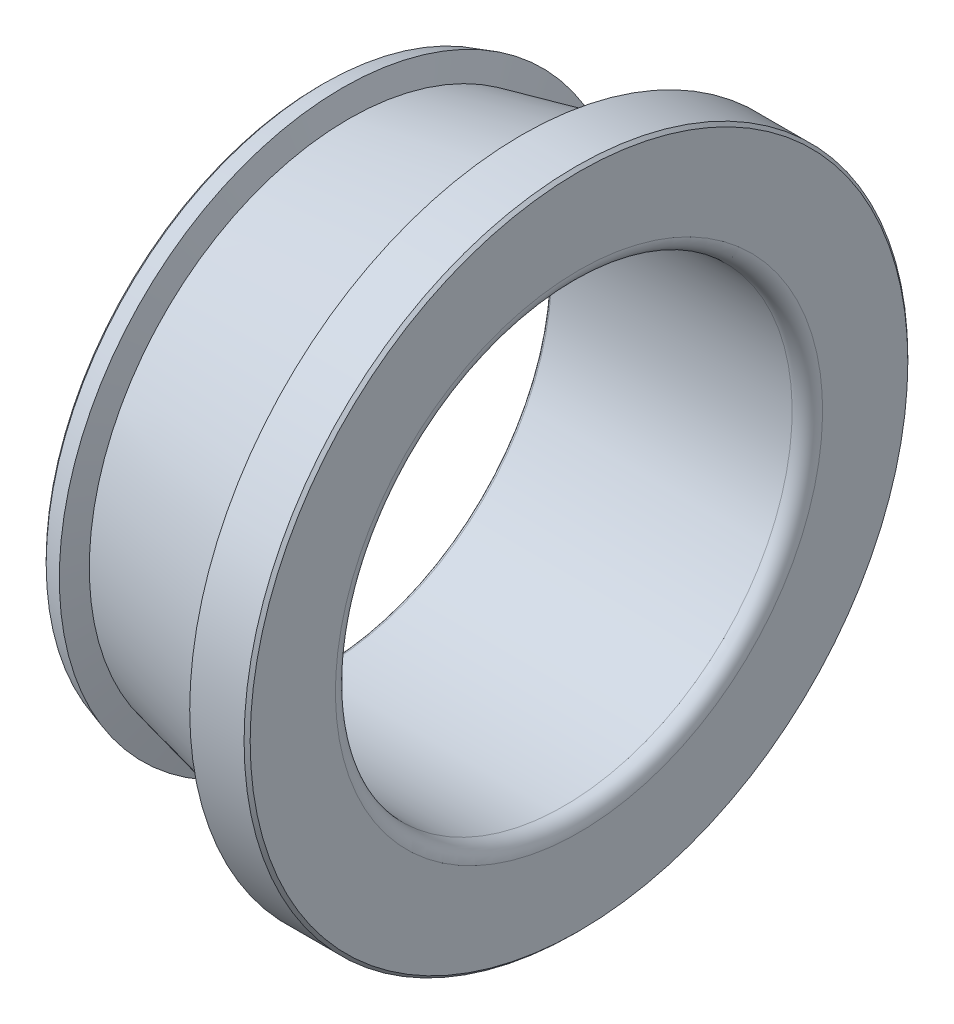
ISO-10303-21;
HEADER;
FILE_DESCRIPTION(('STEP AP214'),'2;1');
FILE_NAME('part.step','',(''),(''),'','','');
FILE_SCHEMA(('AUTOMOTIVE_DESIGN { 1 0 10303 214 1 1 1 1 }'));
ENDSEC;
DATA;
#1=APPLICATION_CONTEXT('core data for automotive mechanical design processes');
#2=APPLICATION_PROTOCOL_DEFINITION('international standard','automotive_design',2000,#1);
#3=PRODUCT_CONTEXT('',#1,'mechanical');
#4=PRODUCT('Part','Part','',(#3));
#5=PRODUCT_RELATED_PRODUCT_CATEGORY('part','',(#4));
#6=PRODUCT_DEFINITION_FORMATION('','',#4);
#7=PRODUCT_DEFINITION_CONTEXT('part definition',#1,'design');
#8=PRODUCT_DEFINITION('design','',#6,#7);
#9=PRODUCT_DEFINITION_SHAPE('','',#8);
#10=(LENGTH_UNIT() NAMED_UNIT(*) SI_UNIT(.MILLI.,.METRE.));
#11=(NAMED_UNIT(*) PLANE_ANGLE_UNIT() SI_UNIT($,.RADIAN.));
#12=(NAMED_UNIT(*) SI_UNIT($,.STERADIAN.) SOLID_ANGLE_UNIT());
#13=UNCERTAINTY_MEASURE_WITH_UNIT(LENGTH_MEASURE(1.E-05),#10,'distance_accuracy_value','');
#14=(GEOMETRIC_REPRESENTATION_CONTEXT(3) GLOBAL_UNCERTAINTY_ASSIGNED_CONTEXT((#13)) GLOBAL_UNIT_ASSIGNED_CONTEXT((#10,
#11,#12)) REPRESENTATION_CONTEXT('',''));
#15=CARTESIAN_POINT('',(0.,0.,0.));
#16=DIRECTION('',(0.,0.,1.));
#17=DIRECTION('',(1.,0.,0.));
#18=AXIS2_PLACEMENT_3D('',#15,#16,#17);
#19=CARTESIAN_POINT('',(5.95,0.,0.));
#20=DIRECTION('',(1.,0.,0.));
#21=DIRECTION('',(0.,1.,0.));
#22=AXIS2_PLACEMENT_3D('',#19,#20,#21);
#23=CONICAL_SURFACE('',#22,20.,0.30337991783948);
#24=CARTESIAN_POINT('',(0.2,0.,0.));
#25=DIRECTION('',(1.,0.,0.));
#26=DIRECTION('',(0.,1.,0.));
#27=AXIS2_PLACEMENT_3D('',#24,#25,#26);
#28=CIRCLE('',#27,18.2);
#29=CARTESIAN_POINT('',(0.2,18.2,0.));
#30=VERTEX_POINT('',#29);
#31=EDGE_CURVE('E10',#30,#30,#28,.T.);
#32=ORIENTED_EDGE('',*,*,#31,.T.);
#33=EDGE_LOOP('',(#32));
#34=FACE_BOUND('',#33,.T.);
#35=CARTESIAN_POINT('',(1.45625119525354,0.,0.));
#36=DIRECTION('',(-1.,0.,0.));
#37=DIRECTION('',(0.,1.,0.));
#38=AXIS2_PLACEMENT_3D('',#35,#36,#37);
#39=CIRCLE('',#38,18.5932612437315);
#40=CARTESIAN_POINT('',(1.45625119525354,-18.5932612437315,0.));
#41=VERTEX_POINT('',#40);
#42=EDGE_CURVE('E76',#41,#41,#39,.T.);
#43=ORIENTED_EDGE('',*,*,#42,.T.);
#44=EDGE_LOOP('',(#43));
#45=FACE_BOUND('',#44,.T.);
#46=ADVANCED_FACE('F15',(#34,#45),#23,.T.);
#47=CARTESIAN_POINT('',(0.1,0.,0.));
#48=DIRECTION('',(1.,0.,0.));
#49=DIRECTION('',(0.,1.,0.));
#50=AXIS2_PLACEMENT_3D('',#47,#48,#49);
#51=CONICAL_SURFACE('',#50,18.1,0.785398163397446);
#52=CARTESIAN_POINT('',(0.,0.,0.));
#53=DIRECTION('',(1.,0.,0.));
#54=DIRECTION('',(0.,1.,0.));
#55=AXIS2_PLACEMENT_3D('',#52,#53,#54);
#56=CIRCLE('',#55,18.);
#57=CARTESIAN_POINT('',(0.,18.,0.));
#58=VERTEX_POINT('',#57);
#59=EDGE_CURVE('E25',#58,#58,#56,.T.);
#60=ORIENTED_EDGE('',*,*,#59,.T.);
#61=EDGE_LOOP('',(#60));
#62=FACE_BOUND('',#61,.T.);
#63=ORIENTED_EDGE('',*,*,#31,.F.);
#64=EDGE_LOOP('',(#63));
#65=FACE_BOUND('',#64,.T.);
#66=ADVANCED_FACE('F103',(#62,#65),#51,.T.);
#67=CARTESIAN_POINT('',(0.,16.6,0.));
#68=DIRECTION('',(-1.,0.,0.));
#69=DIRECTION('',(0.,-1.,0.));
#70=AXIS2_PLACEMENT_3D('',#67,#68,#69);
#71=PLANE('',#70);
#72=CARTESIAN_POINT('',(0.,0.,0.));
#73=DIRECTION('',(1.,0.,0.));
#74=DIRECTION('',(0.,1.,0.));
#75=AXIS2_PLACEMENT_3D('',#72,#73,#74);
#76=CIRCLE('',#75,15.2);
#77=CARTESIAN_POINT('',(0.,15.2,0.));
#78=VERTEX_POINT('',#77);
#79=EDGE_CURVE('E61',#78,#78,#76,.T.);
#80=ORIENTED_EDGE('',*,*,#79,.T.);
#81=EDGE_LOOP('',(#80));
#82=FACE_BOUND('',#81,.T.);
#83=ORIENTED_EDGE('',*,*,#59,.F.);
#84=EDGE_LOOP('',(#83));
#85=FACE_BOUND('',#84,.T.);
#86=ADVANCED_FACE('F62',(#82,#85),#71,.T.);
#87=CARTESIAN_POINT('',(0.2,0.,0.));
#88=DIRECTION('',(1.,0.,0.));
#89=DIRECTION('',(0.,0.,-1.));
#90=AXIS2_PLACEMENT_3D('',#87,#88,#89);
#91=TOROIDAL_SURFACE('',#90,15.2,0.2);
#92=CARTESIAN_POINT('',(0.2,0.,0.));
#93=DIRECTION('',(1.,0.,0.));
#94=DIRECTION('',(0.,1.,0.));
#95=AXIS2_PLACEMENT_3D('',#92,#93,#94);
#96=CIRCLE('',#95,15.);
#97=CARTESIAN_POINT('',(0.2,15.,0.));
#98=VERTEX_POINT('',#97);
#99=EDGE_CURVE('E19',#98,#98,#96,.T.);
#100=ORIENTED_EDGE('',*,*,#99,.T.);
#101=EDGE_LOOP('',(#100));
#102=FACE_BOUND('',#101,.T.);
#103=ORIENTED_EDGE('',*,*,#79,.F.);
#104=EDGE_LOOP('',(#103));
#105=FACE_BOUND('',#104,.T.);
#106=ADVANCED_FACE('F112',(#102,#105),#91,.T.);
#107=CARTESIAN_POINT('',(8.1,0.,0.));
#108=DIRECTION('',(-1.,0.,0.));
#109=DIRECTION('',(0.,1.,0.));
#110=AXIS2_PLACEMENT_3D('',#107,#108,#109);
#111=CYLINDRICAL_SURFACE('',#110,15.);
#112=CARTESIAN_POINT('',(16.,0.,0.));
#113=DIRECTION('',(1.,0.,0.));
#114=DIRECTION('',(0.,1.,0.));
#115=AXIS2_PLACEMENT_3D('',#112,#113,#114);
#116=CIRCLE('',#115,15.);
#117=CARTESIAN_POINT('',(16.,15.,0.));
#118=VERTEX_POINT('',#117);
#119=EDGE_CURVE('E67',#118,#118,#116,.T.);
#120=ORIENTED_EDGE('',*,*,#119,.T.);
#121=EDGE_LOOP('',(#120));
#122=FACE_BOUND('',#121,.T.);
#123=ORIENTED_EDGE('',*,*,#99,.F.);
#124=EDGE_LOOP('',(#123));
#125=FACE_BOUND('',#124,.T.);
#126=ADVANCED_FACE('F99',(#122,#125),#111,.F.);
#127=CARTESIAN_POINT('',(16.,0.,0.));
#128=DIRECTION('',(1.,0.,0.));
#129=DIRECTION('',(0.,0.,-1.));
#130=AXIS2_PLACEMENT_3D('',#127,#128,#129);
#131=TOROIDAL_SURFACE('',#130,16.,1.);
#132=CARTESIAN_POINT('',(17.,0.,0.));
#133=DIRECTION('',(1.,0.,0.));
#134=DIRECTION('',(0.,1.,0.));
#135=AXIS2_PLACEMENT_3D('',#132,#133,#134);
#136=CIRCLE('',#135,16.);
#137=CARTESIAN_POINT('',(17.,16.,0.));
#138=VERTEX_POINT('',#137);
#139=EDGE_CURVE('E81',#138,#138,#136,.T.);
#140=ORIENTED_EDGE('',*,*,#139,.T.);
#141=EDGE_LOOP('',(#140));
#142=FACE_BOUND('',#141,.T.);
#143=ORIENTED_EDGE('',*,*,#119,.F.);
#144=EDGE_LOOP('',(#143));
#145=FACE_BOUND('',#144,.T.);
#146=ADVANCED_FACE('F84',(#142,#145),#131,.T.);
#147=CARTESIAN_POINT('',(17.,18.8,0.));
#148=DIRECTION('',(1.,0.,0.));
#149=DIRECTION('',(0.,1.,0.));
#150=AXIS2_PLACEMENT_3D('',#147,#148,#149);
#151=PLANE('',#150);
#152=CARTESIAN_POINT('',(17.,0.,0.));
#153=DIRECTION('',(1.,0.,0.));
#154=DIRECTION('',(0.,1.,0.));
#155=AXIS2_PLACEMENT_3D('',#152,#153,#154);
#156=CIRCLE('',#155,21.6);
#157=CARTESIAN_POINT('',(17.,21.6,0.));
#158=VERTEX_POINT('',#157);
#159=EDGE_CURVE('E79',#158,#158,#156,.T.);
#160=ORIENTED_EDGE('',*,*,#159,.T.);
#161=EDGE_LOOP('',(#160));
#162=FACE_BOUND('',#161,.T.);
#163=ORIENTED_EDGE('',*,*,#139,.F.);
#164=EDGE_LOOP('',(#163));
#165=FACE_BOUND('',#164,.T.);
#166=ADVANCED_FACE('F87',(#162,#165),#151,.T.);
#167=CARTESIAN_POINT('',(16.9,0.,0.));
#168=DIRECTION('',(-1.,0.,0.));
#169=DIRECTION('',(0.,1.,0.));
#170=AXIS2_PLACEMENT_3D('',#167,#168,#169);
#171=CONICAL_SURFACE('',#170,21.7,0.785398163397448);
#172=CARTESIAN_POINT('',(16.8,0.,0.));
#173=DIRECTION('',(1.,0.,0.));
#174=DIRECTION('',(0.,1.,0.));
#175=AXIS2_PLACEMENT_3D('',#172,#173,#174);
#176=CIRCLE('',#175,21.8);
#177=CARTESIAN_POINT('',(16.8,21.8,0.));
#178=VERTEX_POINT('',#177);
#179=EDGE_CURVE('E70',#178,#178,#176,.T.);
#180=ORIENTED_EDGE('',*,*,#179,.T.);
#181=EDGE_LOOP('',(#180));
#182=FACE_BOUND('',#181,.T.);
#183=ORIENTED_EDGE('',*,*,#159,.F.);
#184=EDGE_LOOP('',(#183));
#185=FACE_BOUND('',#184,.T.);
#186=ADVANCED_FACE('F89',(#182,#185),#171,.T.);
#187=CARTESIAN_POINT('',(14.25,0.,0.));
#188=DIRECTION('',(-1.,0.,0.));
#189=DIRECTION('',(0.,1.,0.));
#190=AXIS2_PLACEMENT_3D('',#187,#188,#189);
#191=CYLINDRICAL_SURFACE('',#190,21.8);
#192=ORIENTED_EDGE('',*,*,#179,.F.);
#193=EDGE_LOOP('',(#192));
#194=FACE_BOUND('',#193,.T.);
#195=CARTESIAN_POINT('',(13.2286182548355,0.,0.));
#196=DIRECTION('',(1.,0.,0.));
#197=DIRECTION('',(0.,1.,0.));
#198=AXIS2_PLACEMENT_3D('',#195,#196,#197);
#199=CIRCLE('',#198,21.8);
#200=CARTESIAN_POINT('',(13.2286182548355,-21.8,0.));
#201=VERTEX_POINT('',#200);
#202=EDGE_CURVE('E77',#201,#201,#199,.T.);
#203=ORIENTED_EDGE('',*,*,#202,.T.);
#204=EDGE_LOOP('',(#203));
#205=FACE_BOUND('',#204,.T.);
#206=ADVANCED_FACE('F17',(#194,#205),#191,.T.);
#207=CARTESIAN_POINT('',(12.9830286620604,0.,0.));
#208=DIRECTION('',(-1.,0.,0.));
#209=DIRECTION('',(0.,1.,0.));
#210=AXIS2_PLACEMENT_3D('',#207,#208,#209);
#211=CONICAL_SURFACE('',#210,22.7565083117056,1.31946891450771);
#212=CARTESIAN_POINT('',(13.7601845594506,0.,0.));
#213=DIRECTION('',(1.,0.,0.));
#214=DIRECTION('',(0.,1.,0.));
#215=AXIS2_PLACEMENT_3D('',#212,#213,#214);
#216=CIRCLE('',#215,19.7296859331787);
#217=CARTESIAN_POINT('',(13.7601845594506,19.7296859331787,0.));
#218=VERTEX_POINT('',#217);
#219=EDGE_CURVE('E75',#218,#218,#216,.T.);
#220=ORIENTED_EDGE('',*,*,#219,.T.);
#221=EDGE_LOOP('',(#220));
#222=FACE_BOUND('',#221,.T.);
#223=ORIENTED_EDGE('',*,*,#202,.F.);
#224=EDGE_LOOP('',(#223));
#225=FACE_BOUND('',#224,.T.);
#226=ADVANCED_FACE('F115',(#222,#225),#211,.F.);
#227=CARTESIAN_POINT('',(1.16631409629115,0.,0.));
#228=DIRECTION('',(-1.,0.,0.));
#229=DIRECTION('',(0.,1.,0.));
#230=AXIS2_PLACEMENT_3D('',#227,#228,#229);
#231=CONICAL_SURFACE('',#230,19.7224916882944,1.31946891450771);
#232=CARTESIAN_POINT('',(1.85872223576496,0.,0.));
#233=DIRECTION('',(1.,0.,0.));
#234=DIRECTION('',(0.,1.,0.));
#235=AXIS2_PLACEMENT_3D('',#232,#233,#234);
#236=CIRCLE('',#235,17.0257400343835);
#237=CARTESIAN_POINT('',(1.85872223576495,17.0257400343835,0.));
#238=VERTEX_POINT('',#237);
#239=EDGE_CURVE('E72',#238,#238,#236,.T.);
#240=ORIENTED_EDGE('',*,*,#239,.F.);
#241=EDGE_LOOP('',(#240));
#242=FACE_BOUND('',#241,.T.);
#243=ORIENTED_EDGE('',*,*,#42,.F.);
#244=EDGE_LOOP('',(#243));
#245=FACE_BOUND('',#244,.T.);
#246=ADVANCED_FACE('F118',(#242,#245),#231,.T.);
#247=CARTESIAN_POINT('',(7.80945339760778,0.,0.));
#248=DIRECTION('',(1.,0.,0.));
#249=DIRECTION('',(0.,1.,0.));
#250=AXIS2_PLACEMENT_3D('',#247,#248,#249);
#251=CONICAL_SURFACE('',#250,18.3777129837811,0.223402144255273);
#252=ORIENTED_EDGE('',*,*,#219,.F.);
#253=EDGE_LOOP('',(#252));
#254=FACE_BOUND('',#253,.T.);
#255=ORIENTED_EDGE('',*,*,#239,.T.);
#256=EDGE_LOOP('',(#255));
#257=FACE_BOUND('',#256,.T.);
#258=ADVANCED_FACE('F122',(#254,#257),#251,.T.);
#259=CLOSED_SHELL('',(#46,#66,#86,#106,#126,#146,#166,#186,#206,#226,#246,#258));
#260=MANIFOLD_SOLID_BREP('B1',#259);
#261=ADVANCED_BREP_SHAPE_REPRESENTATION('',(#18,#260),#14);
#262=SHAPE_DEFINITION_REPRESENTATION(#9,#261);
ENDSEC;
END-ISO-10303-21;
